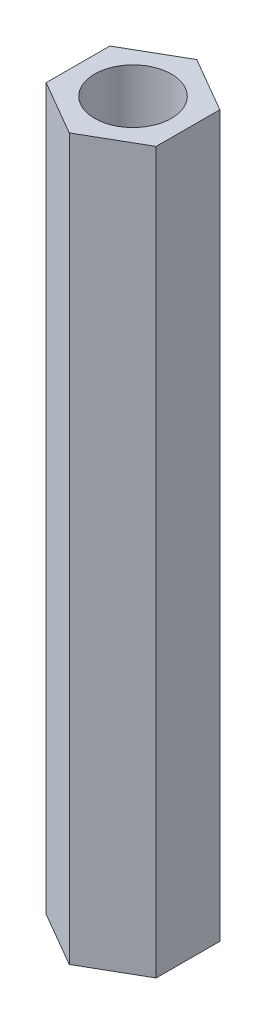
ISO-10303-21;
HEADER;
FILE_DESCRIPTION(('STEP AP214'),'2;1');
FILE_NAME('part.step','',(''),(''),'','','');
FILE_SCHEMA(('AUTOMOTIVE_DESIGN { 1 0 10303 214 1 1 1 1 }'));
ENDSEC;
DATA;
#1=APPLICATION_CONTEXT('core data for automotive mechanical design processes');
#2=APPLICATION_PROTOCOL_DEFINITION('international standard','automotive_design',2000,#1);
#3=PRODUCT_CONTEXT('',#1,'mechanical');
#4=PRODUCT('Part','Part','',(#3));
#5=PRODUCT_RELATED_PRODUCT_CATEGORY('part','',(#4));
#6=PRODUCT_DEFINITION_FORMATION('','',#4);
#7=PRODUCT_DEFINITION_CONTEXT('part definition',#1,'design');
#8=PRODUCT_DEFINITION('design','',#6,#7);
#9=PRODUCT_DEFINITION_SHAPE('','',#8);
#10=(LENGTH_UNIT() NAMED_UNIT(*) SI_UNIT(.MILLI.,.METRE.));
#11=(NAMED_UNIT(*) PLANE_ANGLE_UNIT() SI_UNIT($,.RADIAN.));
#12=(NAMED_UNIT(*) SI_UNIT($,.STERADIAN.) SOLID_ANGLE_UNIT());
#13=UNCERTAINTY_MEASURE_WITH_UNIT(LENGTH_MEASURE(1.E-05),#10,'distance_accuracy_value','');
#14=(GEOMETRIC_REPRESENTATION_CONTEXT(3) GLOBAL_UNCERTAINTY_ASSIGNED_CONTEXT((#13)) GLOBAL_UNIT_ASSIGNED_CONTEXT((#10,
#11,#12)) REPRESENTATION_CONTEXT('',''));
#15=CARTESIAN_POINT('',(0.,0.,0.));
#16=DIRECTION('',(0.,0.,1.));
#17=DIRECTION('',(1.,0.,0.));
#18=AXIS2_PLACEMENT_3D('',#15,#16,#17);
#19=CARTESIAN_POINT('',(-0.00551466071489394,30.,2.65));
#20=DIRECTION('',(-0.498196718894411,0.,-0.867064028364021));
#21=DIRECTION('',(-0.867064028364021,0.,0.498196718894411));
#22=AXIS2_PLACEMENT_3D('',#19,#20,#21);
#23=PLANE('',#22);
#24=DIRECTION('',(0.867064028364021,0.,-0.498196718894411));
#25=VECTOR('',#24,1.);
#26=CARTESIAN_POINT('',(-0.00551466071489394,0.,2.65));
#27=LINE('',#26,#25);
#28=CARTESIAN_POINT('',(-0.00551466071489394,0.,2.65));
#29=VERTEX_POINT('',#28);
#30=CARTESIAN_POINT('',(2.29220998967132,0.,1.32977583627235));
#31=VERTEX_POINT('',#30);
#32=EDGE_CURVE('E128',#29,#31,#27,.T.);
#33=ORIENTED_EDGE('',*,*,#32,.T.);
#34=DIRECTION('',(0.,-1.,0.));
#35=VECTOR('',#34,1.);
#36=CARTESIAN_POINT('',(2.29220998967132,30.,1.32977583627235));
#37=LINE('',#36,#35);
#38=CARTESIAN_POINT('',(2.29220998967132,30.,1.32977583627235));
#39=VERTEX_POINT('',#38);
#40=EDGE_CURVE('E11',#39,#31,#37,.T.);
#41=ORIENTED_EDGE('',*,*,#40,.F.);
#42=DIRECTION('',(0.867064028364021,0.,-0.498196718894411));
#43=VECTOR('',#42,1.);
#44=CARTESIAN_POINT('',(-0.00551466071489394,30.,2.65));
#45=LINE('',#44,#43);
#46=CARTESIAN_POINT('',(-0.00551466071489394,30.,2.65));
#47=VERTEX_POINT('',#46);
#48=EDGE_CURVE('E145',#47,#39,#45,.T.);
#49=ORIENTED_EDGE('',*,*,#48,.F.);
#50=DIRECTION('',(0.,-1.,0.));
#51=VECTOR('',#50,1.);
#52=CARTESIAN_POINT('',(-0.00551466071489394,30.,2.65));
#53=LINE('',#52,#51);
#54=EDGE_CURVE('E124',#47,#29,#53,.T.);
#55=ORIENTED_EDGE('',*,*,#54,.T.);
#56=EDGE_LOOP('',(#33,#41,#49,#55));
#57=FACE_BOUND('',#56,.T.);
#58=ADVANCED_FACE('F39',(#57),#23,.F.);
#59=CARTESIAN_POINT('',(2.29220998967132,30.,1.32977583627235));
#60=DIRECTION('',(-0.999997834718118,0.,-0.00208099953739527));
#61=DIRECTION('',(-0.00208099953739527,0.,0.999997834718118));
#62=AXIS2_PLACEMENT_3D('',#59,#60,#61);
#63=PLANE('',#62);
#64=DIRECTION('',(0.00208099953739527,0.,-0.999997834718118));
#65=VECTOR('',#64,1.);
#66=CARTESIAN_POINT('',(2.29220998967132,0.,1.32977583627235));
#67=LINE('',#66,#65);
#68=CARTESIAN_POINT('',(2.29772465038621,0.,-1.32022416372765));
#69=VERTEX_POINT('',#68);
#70=EDGE_CURVE('E132',#31,#69,#67,.T.);
#71=ORIENTED_EDGE('',*,*,#70,.T.);
#72=DIRECTION('',(0.,-1.,0.));
#73=VECTOR('',#72,1.);
#74=CARTESIAN_POINT('',(2.29772465038621,30.,-1.32022416372765));
#75=LINE('',#74,#73);
#76=CARTESIAN_POINT('',(2.29772465038621,30.,-1.32022416372765));
#77=VERTEX_POINT('',#76);
#78=EDGE_CURVE('E48',#77,#69,#75,.T.);
#79=ORIENTED_EDGE('',*,*,#78,.F.);
#80=DIRECTION('',(0.00208099953739527,0.,-0.999997834718118));
#81=VECTOR('',#80,1.);
#82=CARTESIAN_POINT('',(2.29220998967132,30.,1.32977583627235));
#83=LINE('',#82,#81);
#84=EDGE_CURVE('E93',#39,#77,#83,.T.);
#85=ORIENTED_EDGE('',*,*,#84,.F.);
#86=ORIENTED_EDGE('',*,*,#40,.T.);
#87=EDGE_LOOP('',(#71,#79,#85,#86));
#88=FACE_BOUND('',#87,.T.);
#89=ADVANCED_FACE('F174',(#88),#63,.F.);
#90=CARTESIAN_POINT('',(2.29772465038621,30.,-1.32022416372765));
#91=DIRECTION('',(-0.501801115823708,0.,0.864983028826625));
#92=DIRECTION('',(0.864983028826625,0.,0.501801115823708));
#93=AXIS2_PLACEMENT_3D('',#90,#91,#92);
#94=PLANE('',#93);
#95=DIRECTION('',(-0.864983028826625,0.,-0.501801115823708));
#96=VECTOR('',#95,1.);
#97=CARTESIAN_POINT('',(2.29772465038621,0.,-1.32022416372765));
#98=LINE('',#97,#96);
#99=CARTESIAN_POINT('',(0.00551466071489371,0.,-2.65));
#100=VERTEX_POINT('',#99);
#101=EDGE_CURVE('E136',#69,#100,#98,.T.);
#102=ORIENTED_EDGE('',*,*,#101,.T.);
#103=DIRECTION('',(0.,-1.,0.));
#104=VECTOR('',#103,1.);
#105=CARTESIAN_POINT('',(0.00551466071489371,30.,-2.65));
#106=LINE('',#105,#104);
#107=CARTESIAN_POINT('',(0.00551466071489371,30.,-2.65));
#108=VERTEX_POINT('',#107);
#109=EDGE_CURVE('E117',#108,#100,#106,.T.);
#110=ORIENTED_EDGE('',*,*,#109,.F.);
#111=DIRECTION('',(-0.864983028826625,0.,-0.501801115823708));
#112=VECTOR('',#111,1.);
#113=CARTESIAN_POINT('',(2.29772465038621,30.,-1.32022416372765));
#114=LINE('',#113,#112);
#115=EDGE_CURVE('E106',#77,#108,#114,.T.);
#116=ORIENTED_EDGE('',*,*,#115,.F.);
#117=ORIENTED_EDGE('',*,*,#78,.T.);
#118=EDGE_LOOP('',(#102,#110,#116,#117));
#119=FACE_BOUND('',#118,.T.);
#120=ADVANCED_FACE('F155',(#119),#94,.F.);
#121=CARTESIAN_POINT('',(0.00551466071489371,30.,-2.65));
#122=DIRECTION('',(0.498196718894411,0.,0.867064028364021));
#123=DIRECTION('',(0.867064028364021,0.,-0.498196718894411));
#124=AXIS2_PLACEMENT_3D('',#121,#122,#123);
#125=PLANE('',#124);
#126=DIRECTION('',(-0.867064028364021,0.,0.498196718894411));
#127=VECTOR('',#126,1.);
#128=CARTESIAN_POINT('',(0.00551466071489371,0.,-2.65));
#129=LINE('',#128,#127);
#130=CARTESIAN_POINT('',(-2.29220998967132,0.,-1.32977583627235));
#131=VERTEX_POINT('',#130);
#132=EDGE_CURVE('E115',#100,#131,#129,.T.);
#133=ORIENTED_EDGE('',*,*,#132,.T.);
#134=DIRECTION('',(0.,-1.,0.));
#135=VECTOR('',#134,1.);
#136=CARTESIAN_POINT('',(-2.29220998967132,30.,-1.32977583627235));
#137=LINE('',#136,#135);
#138=CARTESIAN_POINT('',(-2.29220998967132,30.,-1.32977583627235));
#139=VERTEX_POINT('',#138);
#140=EDGE_CURVE('E112',#139,#131,#137,.T.);
#141=ORIENTED_EDGE('',*,*,#140,.F.);
#142=DIRECTION('',(-0.867064028364021,0.,0.498196718894411));
#143=VECTOR('',#142,1.);
#144=CARTESIAN_POINT('',(0.00551466071489371,30.,-2.65));
#145=LINE('',#144,#143);
#146=EDGE_CURVE('E100',#108,#139,#145,.T.);
#147=ORIENTED_EDGE('',*,*,#146,.F.);
#148=ORIENTED_EDGE('',*,*,#109,.T.);
#149=EDGE_LOOP('',(#133,#141,#147,#148));
#150=FACE_BOUND('',#149,.T.);
#151=ADVANCED_FACE('F113',(#150),#125,.F.);
#152=CARTESIAN_POINT('',(-2.29220998967132,30.,-1.32977583627235));
#153=DIRECTION('',(0.999997834718118,0.,0.00208099953739543));
#154=DIRECTION('',(0.00208099953739543,0.,-0.999997834718119));
#155=AXIS2_PLACEMENT_3D('',#152,#153,#154);
#156=PLANE('',#155);
#157=DIRECTION('',(-0.00208099953739543,0.,0.999997834718119));
#158=VECTOR('',#157,1.);
#159=CARTESIAN_POINT('',(-2.29220998967132,0.,-1.32977583627235));
#160=LINE('',#159,#158);
#161=CARTESIAN_POINT('',(-2.29772465038621,0.,1.32022416372765));
#162=VERTEX_POINT('',#161);
#163=EDGE_CURVE('E79',#131,#162,#160,.T.);
#164=ORIENTED_EDGE('',*,*,#163,.T.);
#165=DIRECTION('',(0.,-1.,0.));
#166=VECTOR('',#165,1.);
#167=CARTESIAN_POINT('',(-2.29772465038621,30.,1.32022416372765));
#168=LINE('',#167,#166);
#169=CARTESIAN_POINT('',(-2.29772465038621,30.,1.32022416372765));
#170=VERTEX_POINT('',#169);
#171=EDGE_CURVE('E118',#170,#162,#168,.T.);
#172=ORIENTED_EDGE('',*,*,#171,.F.);
#173=DIRECTION('',(-0.00208099953739543,0.,0.999997834718119));
#174=VECTOR('',#173,1.);
#175=CARTESIAN_POINT('',(-2.29220998967132,30.,-1.32977583627235));
#176=LINE('',#175,#174);
#177=EDGE_CURVE('E104',#139,#170,#176,.T.);
#178=ORIENTED_EDGE('',*,*,#177,.F.);
#179=ORIENTED_EDGE('',*,*,#140,.T.);
#180=EDGE_LOOP('',(#164,#172,#178,#179));
#181=FACE_BOUND('',#180,.T.);
#182=ADVANCED_FACE('F120',(#181),#156,.F.);
#183=CARTESIAN_POINT('',(-2.29772465038621,30.,1.32022416372765));
#184=DIRECTION('',(0.501801115823708,0.,-0.864983028826625));
#185=DIRECTION('',(-0.864983028826625,0.,-0.501801115823708));
#186=AXIS2_PLACEMENT_3D('',#183,#184,#185);
#187=PLANE('',#186);
#188=DIRECTION('',(0.864983028826625,0.,0.501801115823708));
#189=VECTOR('',#188,1.);
#190=CARTESIAN_POINT('',(-2.29772465038621,0.,1.32022416372765));
#191=LINE('',#190,#189);
#192=EDGE_CURVE('E85',#162,#29,#191,.T.);
#193=ORIENTED_EDGE('',*,*,#192,.T.);
#194=ORIENTED_EDGE('',*,*,#54,.F.);
#195=DIRECTION('',(0.864983028826625,0.,0.501801115823708));
#196=VECTOR('',#195,1.);
#197=CARTESIAN_POINT('',(-2.29772465038621,30.,1.32022416372765));
#198=LINE('',#197,#196);
#199=EDGE_CURVE('E56',#170,#47,#198,.T.);
#200=ORIENTED_EDGE('',*,*,#199,.F.);
#201=ORIENTED_EDGE('',*,*,#171,.T.);
#202=EDGE_LOOP('',(#193,#194,#200,#201));
#203=FACE_BOUND('',#202,.T.);
#204=ADVANCED_FACE('F162',(#203),#187,.F.);
#205=CARTESIAN_POINT('',(0.,30.,0.));
#206=DIRECTION('',(0.,1.,0.));
#207=DIRECTION('',(0.,0.,1.));
#208=AXIS2_PLACEMENT_3D('',#205,#206,#207);
#209=PLANE('',#208);
#210=CARTESIAN_POINT('',(0.,30.,0.));
#211=DIRECTION('',(0.,1.,0.));
#212=DIRECTION('',(0.,0.,1.));
#213=AXIS2_PLACEMENT_3D('',#210,#211,#212);
#214=CIRCLE('',#213,1.6);
#215=CARTESIAN_POINT('',(0.,30.,1.6));
#216=VERTEX_POINT('',#215);
#217=EDGE_CURVE('E229',#216,#216,#214,.T.);
#218=ORIENTED_EDGE('',*,*,#217,.F.);
#219=EDGE_LOOP('',(#218));
#220=FACE_BOUND('',#219,.T.);
#221=ORIENTED_EDGE('',*,*,#48,.T.);
#222=ORIENTED_EDGE('',*,*,#84,.T.);
#223=ORIENTED_EDGE('',*,*,#115,.T.);
#224=ORIENTED_EDGE('',*,*,#146,.T.);
#225=ORIENTED_EDGE('',*,*,#177,.T.);
#226=ORIENTED_EDGE('',*,*,#199,.T.);
#227=EDGE_LOOP('',(#221,#222,#223,#224,#225,#226));
#228=FACE_BOUND('',#227,.T.);
#229=ADVANCED_FACE('F102',(#220,#228),#209,.T.);
#230=CARTESIAN_POINT('',(0.,0.,0.));
#231=DIRECTION('',(0.,1.,0.));
#232=DIRECTION('',(0.,0.,1.));
#233=AXIS2_PLACEMENT_3D('',#230,#231,#232);
#234=PLANE('',#233);
#235=CARTESIAN_POINT('',(0.,0.,0.));
#236=DIRECTION('',(0.,1.,0.));
#237=DIRECTION('',(0.,0.,1.));
#238=AXIS2_PLACEMENT_3D('',#235,#236,#237);
#239=CIRCLE('',#238,1.6);
#240=CARTESIAN_POINT('',(0.,0.,1.6));
#241=VERTEX_POINT('',#240);
#242=EDGE_CURVE('E133',#241,#241,#239,.T.);
#243=ORIENTED_EDGE('',*,*,#242,.T.);
#244=EDGE_LOOP('',(#243));
#245=FACE_BOUND('',#244,.T.);
#246=ORIENTED_EDGE('',*,*,#32,.F.);
#247=ORIENTED_EDGE('',*,*,#192,.F.);
#248=ORIENTED_EDGE('',*,*,#163,.F.);
#249=ORIENTED_EDGE('',*,*,#132,.F.);
#250=ORIENTED_EDGE('',*,*,#101,.F.);
#251=ORIENTED_EDGE('',*,*,#70,.F.);
#252=EDGE_LOOP('',(#246,#247,#248,#249,#250,#251));
#253=FACE_BOUND('',#252,.T.);
#254=ADVANCED_FACE('F158',(#245,#253),#234,.F.);
#255=CARTESIAN_POINT('',(0.,0.,0.));
#256=DIRECTION('',(0.,1.,0.));
#257=DIRECTION('',(0.,0.,1.));
#258=AXIS2_PLACEMENT_3D('',#255,#256,#257);
#259=CYLINDRICAL_SURFACE('',#258,1.6);
#260=ORIENTED_EDGE('',*,*,#242,.F.);
#261=EDGE_LOOP('',(#260));
#262=FACE_BOUND('',#261,.T.);
#263=ORIENTED_EDGE('',*,*,#217,.T.);
#264=EDGE_LOOP('',(#263));
#265=FACE_BOUND('',#264,.T.);
#266=ADVANCED_FACE('F211',(#262,#265),#259,.F.);
#267=CLOSED_SHELL('',(#58,#89,#120,#151,#182,#204,#229,#254,#266));
#268=MANIFOLD_SOLID_BREP('B2',#267);
#269=ADVANCED_BREP_SHAPE_REPRESENTATION('',(#18,#268),#14);
#270=SHAPE_DEFINITION_REPRESENTATION(#9,#269);
ENDSEC;
END-ISO-10303-21;
